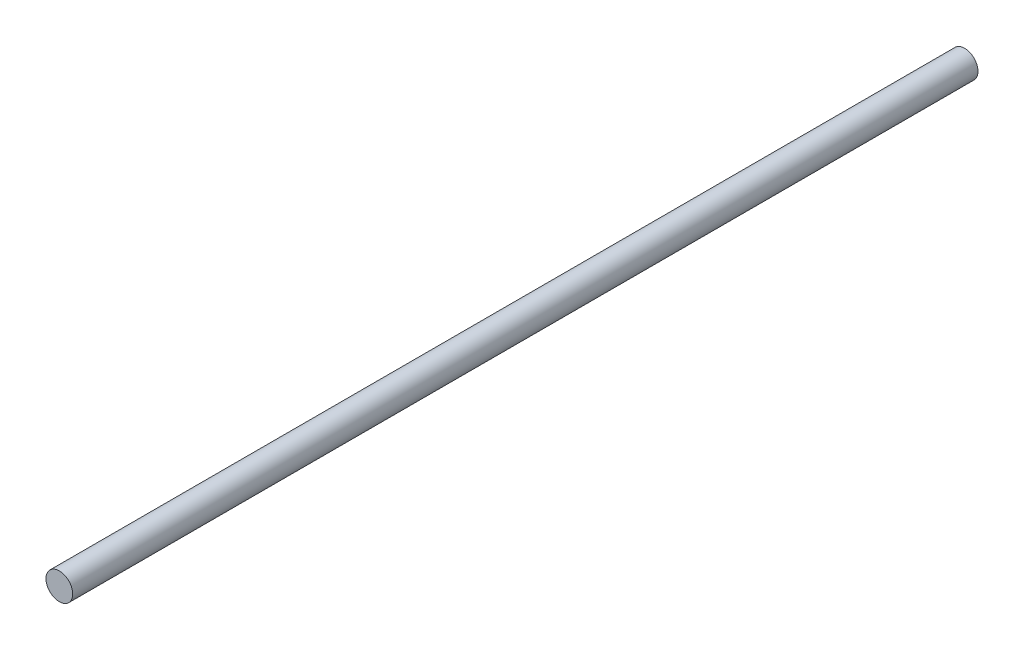
ISO-10303-21;
HEADER;
FILE_DESCRIPTION(('STEP AP214'),'2;1');
FILE_NAME('part.step','',(''),(''),'','','');
FILE_SCHEMA(('AUTOMOTIVE_DESIGN { 1 0 10303 214 1 1 1 1 }'));
ENDSEC;
DATA;
#1=APPLICATION_CONTEXT('core data for automotive mechanical design processes');
#2=APPLICATION_PROTOCOL_DEFINITION('international standard','automotive_design',2000,#1);
#3=PRODUCT_CONTEXT('',#1,'mechanical');
#4=PRODUCT('Part','Part','',(#3));
#5=PRODUCT_RELATED_PRODUCT_CATEGORY('part','',(#4));
#6=PRODUCT_DEFINITION_FORMATION('','',#4);
#7=PRODUCT_DEFINITION_CONTEXT('part definition',#1,'design');
#8=PRODUCT_DEFINITION('design','',#6,#7);
#9=PRODUCT_DEFINITION_SHAPE('','',#8);
#10=(LENGTH_UNIT() NAMED_UNIT(*) SI_UNIT(.MILLI.,.METRE.));
#11=(NAMED_UNIT(*) PLANE_ANGLE_UNIT() SI_UNIT($,.RADIAN.));
#12=(NAMED_UNIT(*) SI_UNIT($,.STERADIAN.) SOLID_ANGLE_UNIT());
#13=UNCERTAINTY_MEASURE_WITH_UNIT(LENGTH_MEASURE(1.E-05),#10,'distance_accuracy_value','');
#14=(GEOMETRIC_REPRESENTATION_CONTEXT(3) GLOBAL_UNCERTAINTY_ASSIGNED_CONTEXT((#13)) GLOBAL_UNIT_ASSIGNED_CONTEXT((#10,
#11,#12)) REPRESENTATION_CONTEXT('',''));
#15=CARTESIAN_POINT('',(0.,0.,0.));
#16=DIRECTION('',(0.,0.,1.));
#17=DIRECTION('',(1.,0.,0.));
#18=AXIS2_PLACEMENT_3D('',#15,#16,#17);
#19=CARTESIAN_POINT('',(0.,0.,105.));
#20=DIRECTION('',(0.,0.,-1.));
#21=DIRECTION('',(-1.,0.,0.));
#22=AXIS2_PLACEMENT_3D('',#19,#20,#21);
#23=CYLINDRICAL_SURFACE('',#22,1.55);
#24=CARTESIAN_POINT('',(0.,0.,105.));
#25=DIRECTION('',(0.,0.,1.));
#26=DIRECTION('',(1.,0.,0.));
#27=AXIS2_PLACEMENT_3D('',#24,#25,#26);
#28=CIRCLE('',#27,1.55);
#29=CARTESIAN_POINT('',(1.55,0.,105.));
#30=VERTEX_POINT('',#29);
#31=EDGE_CURVE('E10',#30,#30,#28,.T.);
#32=ORIENTED_EDGE('',*,*,#31,.F.);
#33=EDGE_LOOP('',(#32));
#34=FACE_BOUND('',#33,.T.);
#35=CARTESIAN_POINT('',(0.,0.,0.));
#36=DIRECTION('',(0.,0.,1.));
#37=DIRECTION('',(1.,0.,0.));
#38=AXIS2_PLACEMENT_3D('',#35,#36,#37);
#39=CIRCLE('',#38,1.55);
#40=CARTESIAN_POINT('',(1.55,0.,0.));
#41=VERTEX_POINT('',#40);
#42=EDGE_CURVE('E34',#41,#41,#39,.T.);
#43=ORIENTED_EDGE('',*,*,#42,.T.);
#44=EDGE_LOOP('',(#43));
#45=FACE_BOUND('',#44,.T.);
#46=ADVANCED_FACE('F31',(#34,#45),#23,.T.);
#47=CARTESIAN_POINT('',(0.,0.,105.));
#48=DIRECTION('',(0.,0.,1.));
#49=DIRECTION('',(1.,0.,0.));
#50=AXIS2_PLACEMENT_3D('',#47,#48,#49);
#51=PLANE('',#50);
#52=ORIENTED_EDGE('',*,*,#31,.T.);
#53=EDGE_LOOP('',(#52));
#54=FACE_BOUND('',#53,.T.);
#55=ADVANCED_FACE('F46',(#54),#51,.T.);
#56=CARTESIAN_POINT('',(0.,0.,0.));
#57=DIRECTION('',(0.,0.,1.));
#58=DIRECTION('',(1.,0.,0.));
#59=AXIS2_PLACEMENT_3D('',#56,#57,#58);
#60=PLANE('',#59);
#61=ORIENTED_EDGE('',*,*,#42,.F.);
#62=EDGE_LOOP('',(#61));
#63=FACE_BOUND('',#62,.T.);
#64=ADVANCED_FACE('F44',(#63),#60,.F.);
#65=CLOSED_SHELL('',(#46,#55,#64));
#66=MANIFOLD_SOLID_BREP('B2',#65);
#67=ADVANCED_BREP_SHAPE_REPRESENTATION('',(#18,#66),#14);
#68=SHAPE_DEFINITION_REPRESENTATION(#9,#67);
ENDSEC;
END-ISO-10303-21;
